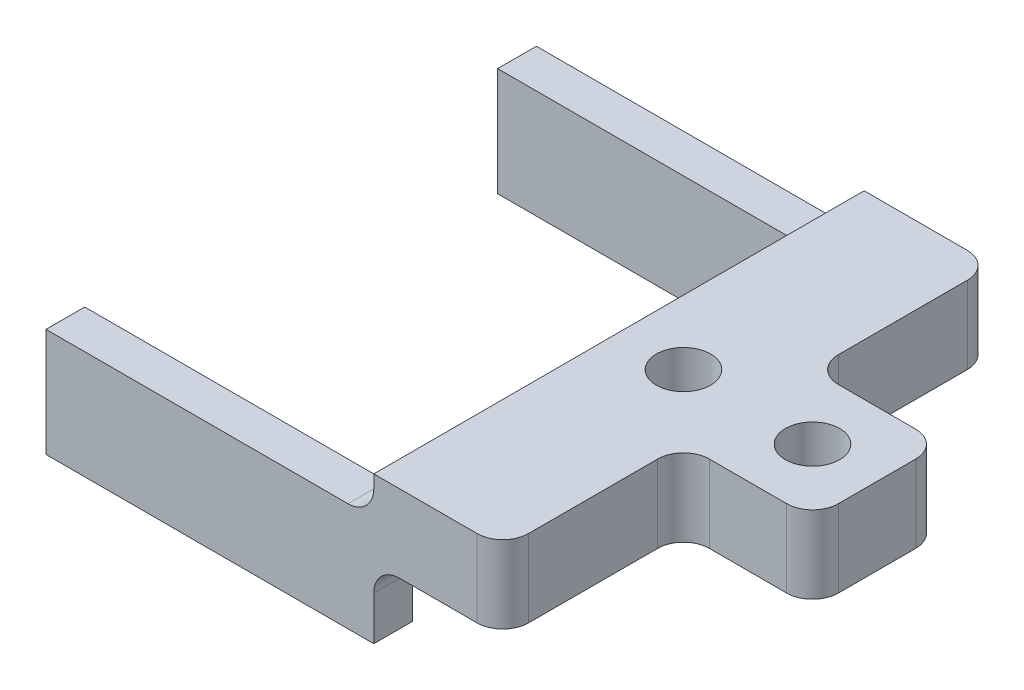
ISO-10303-21;
HEADER;
FILE_DESCRIPTION(('STEP AP214'),'2;1');
FILE_NAME('part.step','',(''),(''),'','','');
FILE_SCHEMA(('AUTOMOTIVE_DESIGN { 1 0 10303 214 1 1 1 1 }'));
ENDSEC;
DATA;
#1=APPLICATION_CONTEXT('core data for automotive mechanical design processes');
#2=APPLICATION_PROTOCOL_DEFINITION('international standard','automotive_design',2000,#1);
#3=PRODUCT_CONTEXT('',#1,'mechanical');
#4=PRODUCT('Part','Part','',(#3));
#5=PRODUCT_RELATED_PRODUCT_CATEGORY('part','',(#4));
#6=PRODUCT_DEFINITION_FORMATION('','',#4);
#7=PRODUCT_DEFINITION_CONTEXT('part definition',#1,'design');
#8=PRODUCT_DEFINITION('design','',#6,#7);
#9=PRODUCT_DEFINITION_SHAPE('','',#8);
#10=(LENGTH_UNIT() NAMED_UNIT(*) SI_UNIT(.MILLI.,.METRE.));
#11=(NAMED_UNIT(*) PLANE_ANGLE_UNIT() SI_UNIT($,.RADIAN.));
#12=(NAMED_UNIT(*) SI_UNIT($,.STERADIAN.) SOLID_ANGLE_UNIT());
#13=UNCERTAINTY_MEASURE_WITH_UNIT(LENGTH_MEASURE(1.E-05),#10,'distance_accuracy_value','');
#14=(GEOMETRIC_REPRESENTATION_CONTEXT(3) GLOBAL_UNCERTAINTY_ASSIGNED_CONTEXT((#13)) GLOBAL_UNIT_ASSIGNED_CONTEXT((#10,
#11,#12)) REPRESENTATION_CONTEXT('',''));
#15=CARTESIAN_POINT('',(0.,0.,0.));
#16=DIRECTION('',(0.,0.,1.));
#17=DIRECTION('',(1.,0.,0.));
#18=AXIS2_PLACEMENT_3D('',#15,#16,#17);
#19=CARTESIAN_POINT('',(-50.8216745568213,5.4,-79.6845406517609));
#20=DIRECTION('',(-1.,0.,0.));
#21=DIRECTION('',(0.,0.,1.));
#22=AXIS2_PLACEMENT_3D('',#19,#20,#21);
#23=PLANE('',#22);
#24=DIRECTION('',(0.,-1.,0.));
#25=VECTOR('',#24,1.);
#26=CARTESIAN_POINT('',(-50.8216745568213,8.4,-44.6845406517609));
#27=LINE('',#26,#25);
#28=CARTESIAN_POINT('',(-50.8216745568213,10.4,-44.6845406517609));
#29=VERTEX_POINT('',#28);
#30=CARTESIAN_POINT('',(-50.8216745568213,5.4,-44.6845406517609));
#31=VERTEX_POINT('',#30);
#32=EDGE_CURVE('E261',#29,#31,#27,.T.);
#33=ORIENTED_EDGE('',*,*,#32,.F.);
#34=DIRECTION('',(0.,0.,-1.));
#35=VECTOR('',#34,1.);
#36=CARTESIAN_POINT('',(-50.8216745568213,10.4,-41.6845406517609));
#37=LINE('',#36,#35);
#38=CARTESIAN_POINT('',(-50.8216745568213,10.4,-41.6845406517609));
#39=VERTEX_POINT('',#38);
#40=EDGE_CURVE('E463',#29,#39,#37,.F.);
#41=ORIENTED_EDGE('',*,*,#40,.T.);
#42=DIRECTION('',(0.,1.,0.));
#43=VECTOR('',#42,1.);
#44=CARTESIAN_POINT('',(-50.8216745568213,5.4,-41.6845406517609));
#45=LINE('',#44,#43);
#46=CARTESIAN_POINT('',(-50.8216745568213,11.4,-41.6845406517609));
#47=VERTEX_POINT('',#46);
#48=EDGE_CURVE('E323',#39,#47,#45,.T.);
#49=ORIENTED_EDGE('',*,*,#48,.T.);
#50=DIRECTION('',(0.,0.,1.));
#51=VECTOR('',#50,1.);
#52=CARTESIAN_POINT('',(-50.8216745568213,11.4,-79.6845406517609));
#53=LINE('',#52,#51);
#54=CARTESIAN_POINT('',(-50.8216745568213,11.4,-79.6845406517609));
#55=VERTEX_POINT('',#54);
#56=EDGE_CURVE('E253',#55,#47,#53,.T.);
#57=ORIENTED_EDGE('',*,*,#56,.F.);
#58=DIRECTION('',(0.,1.,0.));
#59=VECTOR('',#58,1.);
#60=CARTESIAN_POINT('',(-50.8216745568213,5.4,-79.6845406517609));
#61=LINE('',#60,#59);
#62=CARTESIAN_POINT('',(-50.8216745568213,10.4,-79.6845406517609));
#63=VERTEX_POINT('',#62);
#64=EDGE_CURVE('E324',#63,#55,#61,.T.);
#65=ORIENTED_EDGE('',*,*,#64,.F.);
#66=DIRECTION('',(0.,0.,-1.));
#67=VECTOR('',#66,1.);
#68=CARTESIAN_POINT('',(-50.8216745568213,10.4,-76.6845406517609));
#69=LINE('',#68,#67);
#70=CARTESIAN_POINT('',(-50.8216745568213,10.4,-76.6845406517609));
#71=VERTEX_POINT('',#70);
#72=EDGE_CURVE('E459',#63,#71,#69,.F.);
#73=ORIENTED_EDGE('',*,*,#72,.T.);
#74=DIRECTION('',(0.,-1.,0.));
#75=VECTOR('',#74,1.);
#76=CARTESIAN_POINT('',(-50.8216745568213,8.4,-76.6845406517609));
#77=LINE('',#76,#75);
#78=CARTESIAN_POINT('',(-50.8216745568213,5.4,-76.6845406517609));
#79=VERTEX_POINT('',#78);
#80=EDGE_CURVE('E362',#71,#79,#77,.T.);
#81=ORIENTED_EDGE('',*,*,#80,.T.);
#82=DIRECTION('',(0.,0.,1.));
#83=VECTOR('',#82,1.);
#84=CARTESIAN_POINT('',(-50.8216745568213,5.4,-79.6845406517609));
#85=LINE('',#84,#83);
#86=EDGE_CURVE('E292',#79,#31,#85,.T.);
#87=ORIENTED_EDGE('',*,*,#86,.T.);
#88=EDGE_LOOP('',(#33,#41,#49,#57,#65,#73,#81,#87));
#89=FACE_BOUND('',#88,.T.);
#90=ADVANCED_FACE('F39',(#89),#23,.T.);
#91=CARTESIAN_POINT('',(-76.2216745568213,8.4,-79.6845406517609));
#92=DIRECTION('',(1.,0.,0.));
#93=DIRECTION('',(0.,0.,-1.));
#94=AXIS2_PLACEMENT_3D('',#91,#92,#93);
#95=PLANE('',#94);
#96=DIRECTION('',(0.,0.,1.));
#97=VECTOR('',#96,1.);
#98=CARTESIAN_POINT('',(-76.2216745568213,0.,-79.6845406517609));
#99=LINE('',#98,#97);
#100=CARTESIAN_POINT('',(-76.2216745568213,0.,-79.6845406517609));
#101=VERTEX_POINT('',#100);
#102=CARTESIAN_POINT('',(-76.2216745568213,0.,-76.6845406517609));
#103=VERTEX_POINT('',#102);
#104=EDGE_CURVE('E327',#101,#103,#99,.T.);
#105=ORIENTED_EDGE('',*,*,#104,.T.);
#106=DIRECTION('',(0.,-1.,0.));
#107=VECTOR('',#106,1.);
#108=CARTESIAN_POINT('',(-76.2216745568213,8.4,-76.6845406517609));
#109=LINE('',#108,#107);
#110=CARTESIAN_POINT('',(-76.2216745568213,8.4,-76.6845406517609));
#111=VERTEX_POINT('',#110);
#112=EDGE_CURVE('E366',#111,#103,#109,.T.);
#113=ORIENTED_EDGE('',*,*,#112,.F.);
#114=DIRECTION('',(0.,0.,1.));
#115=VECTOR('',#114,1.);
#116=CARTESIAN_POINT('',(-76.2216745568213,8.4,-79.6845406517609));
#117=LINE('',#116,#115);
#118=CARTESIAN_POINT('',(-76.2216745568213,8.4,-79.6845406517609));
#119=VERTEX_POINT('',#118);
#120=EDGE_CURVE('E330',#119,#111,#117,.T.);
#121=ORIENTED_EDGE('',*,*,#120,.F.);
#122=DIRECTION('',(0.,-1.,0.));
#123=VECTOR('',#122,1.);
#124=CARTESIAN_POINT('',(-76.2216745568213,8.4,-79.6845406517609));
#125=LINE('',#124,#123);
#126=EDGE_CURVE('E341',#119,#101,#125,.T.);
#127=ORIENTED_EDGE('',*,*,#126,.T.);
#128=EDGE_LOOP('',(#105,#113,#121,#127));
#129=FACE_BOUND('',#128,.T.);
#130=ADVANCED_FACE('F520',(#129),#95,.F.);
#131=CARTESIAN_POINT('',(-76.2216745568213,8.4,-76.6845406517609));
#132=DIRECTION('',(0.,0.,-1.));
#133=DIRECTION('',(-1.,0.,0.));
#134=AXIS2_PLACEMENT_3D('',#131,#132,#133);
#135=PLANE('',#134);
#136=DIRECTION('',(1.,0.,0.));
#137=VECTOR('',#136,1.);
#138=CARTESIAN_POINT('',(-76.2216745568213,0.,-76.6845406517609));
#139=LINE('',#138,#137);
#140=CARTESIAN_POINT('',(-50.8216745568213,0.,-76.6845406517609));
#141=VERTEX_POINT('',#140);
#142=EDGE_CURVE('E345',#103,#141,#139,.T.);
#143=ORIENTED_EDGE('',*,*,#142,.T.);
#144=CARTESIAN_POINT('',(-50.8216745568213,3.4,-76.6845406517609));
#145=VERTEX_POINT('',#144);
#146=EDGE_CURVE('E361',#145,#141,#77,.T.);
#147=ORIENTED_EDGE('',*,*,#146,.F.);
#148=CARTESIAN_POINT('',(-48.8216745568213,3.4,-76.6845406517609));
#149=DIRECTION('',(0.,0.,-1.));
#150=DIRECTION('',(-1.,0.,0.));
#151=AXIS2_PLACEMENT_3D('',#148,#149,#150);
#152=CIRCLE('',#151,2.);
#153=CARTESIAN_POINT('',(-48.8216745568213,5.4,-76.6845406517609));
#154=VERTEX_POINT('',#153);
#155=EDGE_CURVE('E482',#145,#154,#152,.T.);
#156=ORIENTED_EDGE('',*,*,#155,.T.);
#157=DIRECTION('',(1.,0.,0.));
#158=VECTOR('',#157,1.);
#159=CARTESIAN_POINT('',(-76.2216745568213,5.4,-76.6845406517609));
#160=LINE('',#159,#158);
#161=EDGE_CURVE('E55',#79,#154,#160,.T.);
#162=ORIENTED_EDGE('',*,*,#161,.F.);
#163=ORIENTED_EDGE('',*,*,#80,.F.);
#164=CARTESIAN_POINT('',(-52.8216745568213,10.4,-76.6845406517609));
#165=DIRECTION('',(0.,0.,-1.));
#166=DIRECTION('',(-1.,0.,0.));
#167=AXIS2_PLACEMENT_3D('',#164,#165,#166);
#168=CIRCLE('',#167,2.);
#169=CARTESIAN_POINT('',(-52.8216745568213,8.4,-76.6845406517609));
#170=VERTEX_POINT('',#169);
#171=EDGE_CURVE('E11',#71,#170,#168,.T.);
#172=ORIENTED_EDGE('',*,*,#171,.T.);
#173=DIRECTION('',(1.,0.,0.));
#174=VECTOR('',#173,1.);
#175=CARTESIAN_POINT('',(-76.2216745568213,8.4,-76.6845406517609));
#176=LINE('',#175,#174);
#177=EDGE_CURVE('E334',#111,#170,#176,.T.);
#178=ORIENTED_EDGE('',*,*,#177,.F.);
#179=ORIENTED_EDGE('',*,*,#112,.T.);
#180=EDGE_LOOP('',(#143,#147,#156,#162,#163,#172,#178,#179));
#181=FACE_BOUND('',#180,.T.);
#182=ADVANCED_FACE('F515',(#181),#135,.F.);
#183=CARTESIAN_POINT('',(-50.8216745568213,8.4,-79.6845406517609));
#184=DIRECTION('',(-1.,0.,0.));
#185=DIRECTION('',(0.,0.,1.));
#186=AXIS2_PLACEMENT_3D('',#183,#184,#185);
#187=PLANE('',#186);
#188=DIRECTION('',(0.,-1.,0.));
#189=VECTOR('',#188,1.);
#190=CARTESIAN_POINT('',(-50.8216745568213,8.4,-79.6845406517609));
#191=LINE('',#190,#189);
#192=CARTESIAN_POINT('',(-50.8216745568213,3.4,-79.6845406517609));
#193=VERTEX_POINT('',#192);
#194=CARTESIAN_POINT('',(-50.8216745568213,0.,-79.6845406517609));
#195=VERTEX_POINT('',#194);
#196=EDGE_CURVE('E358',#193,#195,#191,.T.);
#197=ORIENTED_EDGE('',*,*,#196,.F.);
#198=DIRECTION('',(0.,0.,1.));
#199=VECTOR('',#198,1.);
#200=CARTESIAN_POINT('',(-50.8216745568213,3.4,-76.6845406517609));
#201=LINE('',#200,#199);
#202=EDGE_CURVE('E448',#193,#145,#201,.T.);
#203=ORIENTED_EDGE('',*,*,#202,.T.);
#204=ORIENTED_EDGE('',*,*,#146,.T.);
#205=DIRECTION('',(0.,0.,-1.));
#206=VECTOR('',#205,1.);
#207=CARTESIAN_POINT('',(-50.8216745568213,0.,-79.6845406517609));
#208=LINE('',#207,#206);
#209=EDGE_CURVE('E349',#141,#195,#208,.T.);
#210=ORIENTED_EDGE('',*,*,#209,.T.);
#211=EDGE_LOOP('',(#197,#203,#204,#210));
#212=FACE_BOUND('',#211,.T.);
#213=ADVANCED_FACE('F526',(#212),#187,.F.);
#214=CARTESIAN_POINT('',(-76.2216745568213,8.4,-79.6845406517609));
#215=DIRECTION('',(0.,0.,1.));
#216=DIRECTION('',(1.,0.,0.));
#217=AXIS2_PLACEMENT_3D('',#214,#215,#216);
#218=PLANE('',#217);
#219=DIRECTION('',(-1.,0.,0.));
#220=VECTOR('',#219,1.);
#221=CARTESIAN_POINT('',(-50.8216745568213,11.4,-79.6845406517609));
#222=LINE('',#221,#220);
#223=CARTESIAN_POINT('',(-42.8216745568213,11.4,-79.6845406517609));
#224=VERTEX_POINT('',#223);
#225=EDGE_CURVE('E288',#224,#55,#222,.T.);
#226=ORIENTED_EDGE('',*,*,#225,.F.);
#227=DIRECTION('',(0.,1.,0.));
#228=VECTOR('',#227,1.);
#229=CARTESIAN_POINT('',(-42.8216745568213,5.4,-79.6845406517609));
#230=LINE('',#229,#228);
#231=CARTESIAN_POINT('',(-42.8216745568213,5.4,-79.6845406517609));
#232=VERTEX_POINT('',#231);
#233=EDGE_CURVE('E445',#224,#232,#230,.F.);
#234=ORIENTED_EDGE('',*,*,#233,.T.);
#235=DIRECTION('',(-1.,0.,0.));
#236=VECTOR('',#235,1.);
#237=CARTESIAN_POINT('',(-50.8216745568213,5.4,-79.6845406517609));
#238=LINE('',#237,#236);
#239=CARTESIAN_POINT('',(-48.8216745568213,5.4,-79.6845406517609));
#240=VERTEX_POINT('',#239);
#241=EDGE_CURVE('E319',#232,#240,#238,.T.);
#242=ORIENTED_EDGE('',*,*,#241,.T.);
#243=CARTESIAN_POINT('',(-48.8216745568213,3.4,-79.6845406517609));
#244=DIRECTION('',(0.,0.,1.));
#245=DIRECTION('',(1.,0.,0.));
#246=AXIS2_PLACEMENT_3D('',#243,#244,#245);
#247=CIRCLE('',#246,2.);
#248=EDGE_CURVE('E485',#240,#193,#247,.T.);
#249=ORIENTED_EDGE('',*,*,#248,.T.);
#250=ORIENTED_EDGE('',*,*,#196,.T.);
#251=DIRECTION('',(-1.,0.,0.));
#252=VECTOR('',#251,1.);
#253=CARTESIAN_POINT('',(-76.2216745568213,0.,-79.6845406517609));
#254=LINE('',#253,#252);
#255=EDGE_CURVE('E335',#195,#101,#254,.T.);
#256=ORIENTED_EDGE('',*,*,#255,.T.);
#257=ORIENTED_EDGE('',*,*,#126,.F.);
#258=DIRECTION('',(-1.,0.,0.));
#259=VECTOR('',#258,1.);
#260=CARTESIAN_POINT('',(-76.2216745568213,8.4,-79.6845406517609));
#261=LINE('',#260,#259);
#262=CARTESIAN_POINT('',(-52.8216745568213,8.4,-79.6845406517609));
#263=VERTEX_POINT('',#262);
#264=EDGE_CURVE('E338',#263,#119,#261,.T.);
#265=ORIENTED_EDGE('',*,*,#264,.F.);
#266=CARTESIAN_POINT('',(-52.8216745568213,10.4,-79.6845406517609));
#267=DIRECTION('',(0.,0.,1.));
#268=DIRECTION('',(1.,0.,0.));
#269=AXIS2_PLACEMENT_3D('',#266,#267,#268);
#270=CIRCLE('',#269,2.);
#271=EDGE_CURVE('E48',#263,#63,#270,.T.);
#272=ORIENTED_EDGE('',*,*,#271,.T.);
#273=ORIENTED_EDGE('',*,*,#64,.T.);
#274=EDGE_LOOP('',(#226,#234,#242,#249,#250,#256,#257,#265,#272,#273));
#275=FACE_BOUND('',#274,.T.);
#276=ADVANCED_FACE('F504',(#275),#218,.F.);
#277=CARTESIAN_POINT('',(0.,8.4,0.));
#278=DIRECTION('',(0.,1.,0.));
#279=DIRECTION('',(0.,0.,1.));
#280=AXIS2_PLACEMENT_3D('',#277,#278,#279);
#281=PLANE('',#280);
#282=ORIENTED_EDGE('',*,*,#177,.T.);
#283=DIRECTION('',(0.,0.,-1.));
#284=VECTOR('',#283,1.);
#285=CARTESIAN_POINT('',(-52.8216745568213,8.4,-79.6845406517609));
#286=LINE('',#285,#284);
#287=EDGE_CURVE('E466',#170,#263,#286,.T.);
#288=ORIENTED_EDGE('',*,*,#287,.T.);
#289=ORIENTED_EDGE('',*,*,#264,.T.);
#290=ORIENTED_EDGE('',*,*,#120,.T.);
#291=EDGE_LOOP('',(#282,#288,#289,#290));
#292=FACE_BOUND('',#291,.T.);
#293=ADVANCED_FACE('F512',(#292),#281,.T.);
#294=CARTESIAN_POINT('',(0.,0.,0.));
#295=DIRECTION('',(0.,1.,0.));
#296=DIRECTION('',(0.,0.,1.));
#297=AXIS2_PLACEMENT_3D('',#294,#295,#296);
#298=PLANE('',#297);
#299=ORIENTED_EDGE('',*,*,#104,.F.);
#300=ORIENTED_EDGE('',*,*,#255,.F.);
#301=ORIENTED_EDGE('',*,*,#209,.F.);
#302=ORIENTED_EDGE('',*,*,#142,.F.);
#303=EDGE_LOOP('',(#299,#300,#301,#302));
#304=FACE_BOUND('',#303,.T.);
#305=ADVANCED_FACE('F523',(#304),#298,.F.);
#306=CARTESIAN_POINT('',(-40.8216745568213,5.4,-79.6845406517609));
#307=DIRECTION('',(1.,0.,0.));
#308=DIRECTION('',(0.,0.,-1.));
#309=AXIS2_PLACEMENT_3D('',#306,#307,#308);
#310=PLANE('',#309);
#311=DIRECTION('',(0.,0.,-1.));
#312=VECTOR('',#311,1.);
#313=CARTESIAN_POINT('',(-40.8216745568213,11.4,-79.6845406517609));
#314=LINE('',#313,#312);
#315=CARTESIAN_POINT('',(-40.8216745568213,11.4,-67.6845406517609));
#316=VERTEX_POINT('',#315);
#317=CARTESIAN_POINT('',(-40.8216745568213,11.4,-77.6845406517609));
#318=VERTEX_POINT('',#317);
#319=EDGE_CURVE('E284',#316,#318,#314,.T.);
#320=ORIENTED_EDGE('',*,*,#319,.F.);
#321=DIRECTION('',(0.,1.,0.));
#322=VECTOR('',#321,1.);
#323=CARTESIAN_POINT('',(-40.8216745568213,5.4,-67.6845406517609));
#324=LINE('',#323,#322);
#325=CARTESIAN_POINT('',(-40.8216745568213,5.4,-67.6845406517609));
#326=VERTEX_POINT('',#325);
#327=EDGE_CURVE('E442',#316,#326,#324,.F.);
#328=ORIENTED_EDGE('',*,*,#327,.T.);
#329=DIRECTION('',(0.,0.,-1.));
#330=VECTOR('',#329,1.);
#331=CARTESIAN_POINT('',(-40.8216745568213,5.4,-79.6845406517609));
#332=LINE('',#331,#330);
#333=CARTESIAN_POINT('',(-40.8216745568213,5.4,-77.6845406517609));
#334=VERTEX_POINT('',#333);
#335=EDGE_CURVE('E315',#326,#334,#332,.T.);
#336=ORIENTED_EDGE('',*,*,#335,.T.);
#337=DIRECTION('',(0.,1.,0.));
#338=VECTOR('',#337,1.);
#339=CARTESIAN_POINT('',(-40.8216745568213,11.4,-77.6845406517609));
#340=LINE('',#339,#338);
#341=EDGE_CURVE('E438',#334,#318,#340,.T.);
#342=ORIENTED_EDGE('',*,*,#341,.T.);
#343=EDGE_LOOP('',(#320,#328,#336,#342));
#344=FACE_BOUND('',#343,.T.);
#345=ADVANCED_FACE('F545',(#344),#310,.T.);
#346=CARTESIAN_POINT('',(-40.8216745568213,5.4,-65.6845406517609));
#347=DIRECTION('',(0.,0.,-1.));
#348=DIRECTION('',(-1.,0.,0.));
#349=AXIS2_PLACEMENT_3D('',#346,#347,#348);
#350=PLANE('',#349);
#351=DIRECTION('',(-1.,0.,0.));
#352=VECTOR('',#351,1.);
#353=CARTESIAN_POINT('',(-40.8216745568213,11.4,-65.6845406517609));
#354=LINE('',#353,#352);
#355=CARTESIAN_POINT('',(-32.8216745568213,11.4,-65.6845406517609));
#356=VERTEX_POINT('',#355);
#357=CARTESIAN_POINT('',(-38.8216745568213,11.4,-65.6845406517609));
#358=VERTEX_POINT('',#357);
#359=EDGE_CURVE('E280',#356,#358,#354,.T.);
#360=ORIENTED_EDGE('',*,*,#359,.F.);
#361=DIRECTION('',(0.,1.,0.));
#362=VECTOR('',#361,1.);
#363=CARTESIAN_POINT('',(-32.8216745568213,5.4,-65.6845406517609));
#364=LINE('',#363,#362);
#365=CARTESIAN_POINT('',(-32.8216745568213,5.4,-65.6845406517609));
#366=VERTEX_POINT('',#365);
#367=EDGE_CURVE('E393',#356,#366,#364,.F.);
#368=ORIENTED_EDGE('',*,*,#367,.T.);
#369=DIRECTION('',(-1.,0.,0.));
#370=VECTOR('',#369,1.);
#371=CARTESIAN_POINT('',(-40.8216745568213,5.4,-65.6845406517609));
#372=LINE('',#371,#370);
#373=CARTESIAN_POINT('',(-38.8216745568213,5.4,-65.6845406517609));
#374=VERTEX_POINT('',#373);
#375=EDGE_CURVE('E311',#366,#374,#372,.T.);
#376=ORIENTED_EDGE('',*,*,#375,.T.);
#377=DIRECTION('',(0.,1.,0.));
#378=VECTOR('',#377,1.);
#379=CARTESIAN_POINT('',(-38.8216745568213,11.4,-65.6845406517609));
#380=LINE('',#379,#378);
#381=EDGE_CURVE('E389',#374,#358,#380,.T.);
#382=ORIENTED_EDGE('',*,*,#381,.T.);
#383=EDGE_LOOP('',(#360,#368,#376,#382));
#384=FACE_BOUND('',#383,.T.);
#385=ADVANCED_FACE('F555',(#384),#350,.T.);
#386=CARTESIAN_POINT('',(-30.8216745568213,5.4,-65.6845406517609));
#387=DIRECTION('',(1.,0.,0.));
#388=DIRECTION('',(0.,0.,-1.));
#389=AXIS2_PLACEMENT_3D('',#386,#387,#388);
#390=PLANE('',#389);
#391=DIRECTION('',(0.,0.,-1.));
#392=VECTOR('',#391,1.);
#393=CARTESIAN_POINT('',(-30.8216745568213,5.4,-65.6845406517609));
#394=LINE('',#393,#392);
#395=CARTESIAN_POINT('',(-30.8216745568213,5.4,-57.6845406517609));
#396=VERTEX_POINT('',#395);
#397=CARTESIAN_POINT('',(-30.8216745568213,5.4,-63.6845406517609));
#398=VERTEX_POINT('',#397);
#399=EDGE_CURVE('E307',#396,#398,#394,.T.);
#400=ORIENTED_EDGE('',*,*,#399,.T.);
#401=DIRECTION('',(0.,1.,0.));
#402=VECTOR('',#401,1.);
#403=CARTESIAN_POINT('',(-30.8216745568213,5.4,-63.6845406517609));
#404=LINE('',#403,#402);
#405=CARTESIAN_POINT('',(-30.8216745568213,11.4,-63.6845406517609));
#406=VERTEX_POINT('',#405);
#407=EDGE_CURVE('E373',#398,#406,#404,.T.);
#408=ORIENTED_EDGE('',*,*,#407,.T.);
#409=DIRECTION('',(0.,0.,-1.));
#410=VECTOR('',#409,1.);
#411=CARTESIAN_POINT('',(-30.8216745568213,11.4,-65.6845406517609));
#412=LINE('',#411,#410);
#413=CARTESIAN_POINT('',(-30.8216745568213,11.4,-57.6845406517609));
#414=VERTEX_POINT('',#413);
#415=EDGE_CURVE('E276',#414,#406,#412,.T.);
#416=ORIENTED_EDGE('',*,*,#415,.F.);
#417=DIRECTION('',(0.,1.,0.));
#418=VECTOR('',#417,1.);
#419=CARTESIAN_POINT('',(-30.8216745568213,5.4,-57.6845406517609));
#420=LINE('',#419,#418);
#421=EDGE_CURVE('E370',#414,#396,#420,.F.);
#422=ORIENTED_EDGE('',*,*,#421,.T.);
#423=EDGE_LOOP('',(#400,#408,#416,#422));
#424=FACE_BOUND('',#423,.T.);
#425=ADVANCED_FACE('F564',(#424),#390,.T.);
#426=CARTESIAN_POINT('',(-40.8216745568213,5.4,-55.6845406517609));
#427=DIRECTION('',(0.,0.,1.));
#428=DIRECTION('',(1.,0.,0.));
#429=AXIS2_PLACEMENT_3D('',#426,#427,#428);
#430=PLANE('',#429);
#431=DIRECTION('',(1.,0.,0.));
#432=VECTOR('',#431,1.);
#433=CARTESIAN_POINT('',(-40.8216745568213,5.4,-55.6845406517609));
#434=LINE('',#433,#432);
#435=CARTESIAN_POINT('',(-38.8216745568213,5.4,-55.6845406517609));
#436=VERTEX_POINT('',#435);
#437=CARTESIAN_POINT('',(-32.8216745568213,5.4,-55.6845406517609));
#438=VERTEX_POINT('',#437);
#439=EDGE_CURVE('E303',#436,#438,#434,.T.);
#440=ORIENTED_EDGE('',*,*,#439,.T.);
#441=DIRECTION('',(0.,1.,0.));
#442=VECTOR('',#441,1.);
#443=CARTESIAN_POINT('',(-32.8216745568213,5.4,-55.6845406517609));
#444=LINE('',#443,#442);
#445=CARTESIAN_POINT('',(-32.8216745568213,11.4,-55.6845406517609));
#446=VERTEX_POINT('',#445);
#447=EDGE_CURVE('E423',#438,#446,#444,.T.);
#448=ORIENTED_EDGE('',*,*,#447,.T.);
#449=DIRECTION('',(1.,0.,0.));
#450=VECTOR('',#449,1.);
#451=CARTESIAN_POINT('',(-40.8216745568213,11.4,-55.6845406517609));
#452=LINE('',#451,#450);
#453=CARTESIAN_POINT('',(-38.8216745568213,11.4,-55.6845406517609));
#454=VERTEX_POINT('',#453);
#455=EDGE_CURVE('E272',#454,#446,#452,.T.);
#456=ORIENTED_EDGE('',*,*,#455,.F.);
#457=DIRECTION('',(0.,1.,0.));
#458=VECTOR('',#457,1.);
#459=CARTESIAN_POINT('',(-38.8216745568213,5.4,-55.6845406517609));
#460=LINE('',#459,#458);
#461=EDGE_CURVE('E420',#454,#436,#460,.F.);
#462=ORIENTED_EDGE('',*,*,#461,.T.);
#463=EDGE_LOOP('',(#440,#448,#456,#462));
#464=FACE_BOUND('',#463,.T.);
#465=ADVANCED_FACE('F572',(#464),#430,.T.);
#466=CARTESIAN_POINT('',(-40.8216745568213,5.4,-55.6845406517609));
#467=DIRECTION('',(1.,0.,0.));
#468=DIRECTION('',(0.,0.,-1.));
#469=AXIS2_PLACEMENT_3D('',#466,#467,#468);
#470=PLANE('',#469);
#471=DIRECTION('',(0.,0.,-1.));
#472=VECTOR('',#471,1.);
#473=CARTESIAN_POINT('',(-40.8216745568213,11.4,-55.6845406517609));
#474=LINE('',#473,#472);
#475=CARTESIAN_POINT('',(-40.8216745568213,11.4,-43.6845406517609));
#476=VERTEX_POINT('',#475);
#477=CARTESIAN_POINT('',(-40.8216745568213,11.4,-53.6845406517609));
#478=VERTEX_POINT('',#477);
#479=EDGE_CURVE('E268',#476,#478,#474,.T.);
#480=ORIENTED_EDGE('',*,*,#479,.F.);
#481=DIRECTION('',(0.,1.,0.));
#482=VECTOR('',#481,1.);
#483=CARTESIAN_POINT('',(-40.8216745568213,5.4,-43.6845406517609));
#484=LINE('',#483,#482);
#485=CARTESIAN_POINT('',(-40.8216745568213,5.4,-43.6845406517609));
#486=VERTEX_POINT('',#485);
#487=EDGE_CURVE('E435',#476,#486,#484,.F.);
#488=ORIENTED_EDGE('',*,*,#487,.T.);
#489=DIRECTION('',(0.,0.,-1.));
#490=VECTOR('',#489,1.);
#491=CARTESIAN_POINT('',(-40.8216745568213,5.4,-55.6845406517609));
#492=LINE('',#491,#490);
#493=CARTESIAN_POINT('',(-40.8216745568213,5.4,-53.6845406517609));
#494=VERTEX_POINT('',#493);
#495=EDGE_CURVE('E299',#486,#494,#492,.T.);
#496=ORIENTED_EDGE('',*,*,#495,.T.);
#497=DIRECTION('',(0.,1.,0.));
#498=VECTOR('',#497,1.);
#499=CARTESIAN_POINT('',(-40.8216745568213,11.4,-53.6845406517609));
#500=LINE('',#499,#498);
#501=EDGE_CURVE('E431',#494,#478,#500,.T.);
#502=ORIENTED_EDGE('',*,*,#501,.T.);
#503=EDGE_LOOP('',(#480,#488,#496,#502));
#504=FACE_BOUND('',#503,.T.);
#505=ADVANCED_FACE('F582',(#504),#470,.T.);
#506=CARTESIAN_POINT('',(-50.8216745568213,5.4,-41.6845406517609));
#507=DIRECTION('',(0.,0.,1.));
#508=DIRECTION('',(1.,0.,0.));
#509=AXIS2_PLACEMENT_3D('',#506,#507,#508);
#510=PLANE('',#509);
#511=DIRECTION('',(1.,0.,0.));
#512=VECTOR('',#511,1.);
#513=CARTESIAN_POINT('',(-50.8216745568213,5.4,-41.6845406517609));
#514=LINE('',#513,#512);
#515=CARTESIAN_POINT('',(-48.8216745568213,5.4,-41.6845406517609));
#516=VERTEX_POINT('',#515);
#517=CARTESIAN_POINT('',(-42.8216745568213,5.4,-41.6845406517609));
#518=VERTEX_POINT('',#517);
#519=EDGE_CURVE('E296',#516,#518,#514,.T.);
#520=ORIENTED_EDGE('',*,*,#519,.T.);
#521=DIRECTION('',(0.,1.,0.));
#522=VECTOR('',#521,1.);
#523=CARTESIAN_POINT('',(-42.8216745568213,5.4,-41.6845406517609));
#524=LINE('',#523,#522);
#525=CARTESIAN_POINT('',(-42.8216745568213,11.4,-41.6845406517609));
#526=VERTEX_POINT('',#525);
#527=EDGE_CURVE('E427',#518,#526,#524,.T.);
#528=ORIENTED_EDGE('',*,*,#527,.T.);
#529=DIRECTION('',(1.,0.,0.));
#530=VECTOR('',#529,1.);
#531=CARTESIAN_POINT('',(-50.8216745568213,11.4,-41.6845406517609));
#532=LINE('',#531,#530);
#533=EDGE_CURVE('E259',#47,#526,#532,.T.);
#534=ORIENTED_EDGE('',*,*,#533,.F.);
#535=ORIENTED_EDGE('',*,*,#48,.F.);
#536=CARTESIAN_POINT('',(-52.8216745568213,10.4,-41.6845406517609));
#537=DIRECTION('',(0.,0.,1.));
#538=DIRECTION('',(1.,0.,0.));
#539=AXIS2_PLACEMENT_3D('',#536,#537,#538);
#540=CIRCLE('',#539,2.);
#541=CARTESIAN_POINT('',(-52.8216745568213,8.4,-41.6845406517609));
#542=VERTEX_POINT('',#541);
#543=EDGE_CURVE('E232',#39,#542,#540,.F.);
#544=ORIENTED_EDGE('',*,*,#543,.T.);
#545=DIRECTION('',(1.,0.,0.));
#546=VECTOR('',#545,1.);
#547=CARTESIAN_POINT('',(-76.2216745568213,8.4,-41.6845406517609));
#548=LINE('',#547,#546);
#549=CARTESIAN_POINT('',(-76.2216745568213,8.4,-41.6845406517609));
#550=VERTEX_POINT('',#549);
#551=EDGE_CURVE('E222',#550,#542,#548,.T.);
#552=ORIENTED_EDGE('',*,*,#551,.F.);
#553=DIRECTION('',(0.,-1.,0.));
#554=VECTOR('',#553,1.);
#555=CARTESIAN_POINT('',(-76.2216745568213,8.4,-41.6845406517609));
#556=LINE('',#555,#554);
#557=CARTESIAN_POINT('',(-76.2216745568213,0.,-41.6845406517609));
#558=VERTEX_POINT('',#557);
#559=EDGE_CURVE('E228',#550,#558,#556,.T.);
#560=ORIENTED_EDGE('',*,*,#559,.T.);
#561=DIRECTION('',(1.,0.,0.));
#562=VECTOR('',#561,1.);
#563=CARTESIAN_POINT('',(-76.2216745568213,0.,-41.6845406517609));
#564=LINE('',#563,#562);
#565=CARTESIAN_POINT('',(-50.8216745568213,0.,-41.6845406517609));
#566=VERTEX_POINT('',#565);
#567=EDGE_CURVE('E617',#558,#566,#564,.T.);
#568=ORIENTED_EDGE('',*,*,#567,.T.);
#569=DIRECTION('',(0.,-1.,0.));
#570=VECTOR('',#569,1.);
#571=CARTESIAN_POINT('',(-50.8216745568213,8.4,-41.6845406517609));
#572=LINE('',#571,#570);
#573=CARTESIAN_POINT('',(-50.8216745568213,3.4,-41.6845406517609));
#574=VERTEX_POINT('',#573);
#575=EDGE_CURVE('E254',#574,#566,#572,.T.);
#576=ORIENTED_EDGE('',*,*,#575,.F.);
#577=CARTESIAN_POINT('',(-48.8216745568213,3.4,-41.6845406517609));
#578=DIRECTION('',(0.,0.,1.));
#579=DIRECTION('',(1.,0.,0.));
#580=AXIS2_PLACEMENT_3D('',#577,#578,#579);
#581=CIRCLE('',#580,2.);
#582=EDGE_CURVE('E488',#574,#516,#581,.F.);
#583=ORIENTED_EDGE('',*,*,#582,.T.);
#584=EDGE_LOOP('',(#520,#528,#534,#535,#544,#552,#560,#568,#576,#583));
#585=FACE_BOUND('',#584,.T.);
#586=ADVANCED_FACE('F225',(#585),#510,.T.);
#587=CARTESIAN_POINT('',(0.,5.4,0.));
#588=DIRECTION('',(0.,1.,0.));
#589=DIRECTION('',(0.,0.,1.));
#590=AXIS2_PLACEMENT_3D('',#587,#588,#589);
#591=PLANE('',#590);
#592=CARTESIAN_POINT('',(-45.8216745568213,5.4,-60.6845406517609));
#593=DIRECTION('',(0.,1.,0.));
#594=DIRECTION('',(0.,0.,1.));
#595=AXIS2_PLACEMENT_3D('',#592,#593,#594);
#596=CIRCLE('',#595,2.1);
#597=CARTESIAN_POINT('',(-45.8216745568213,5.4,-58.5845406517609));
#598=VERTEX_POINT('',#597);
#599=EDGE_CURVE('E622',#598,#598,#596,.F.);
#600=ORIENTED_EDGE('',*,*,#599,.F.);
#601=EDGE_LOOP('',(#600));
#602=FACE_BOUND('',#601,.T.);
#603=CARTESIAN_POINT('',(-35.8216745568213,5.4,-60.6845406517609));
#604=DIRECTION('',(0.,1.,0.));
#605=DIRECTION('',(0.,0.,1.));
#606=AXIS2_PLACEMENT_3D('',#603,#604,#605);
#607=CIRCLE('',#606,2.1);
#608=CARTESIAN_POINT('',(-35.8216745568213,5.4,-58.5845406517609));
#609=VERTEX_POINT('',#608);
#610=EDGE_CURVE('E625',#609,#609,#607,.F.);
#611=ORIENTED_EDGE('',*,*,#610,.F.);
#612=EDGE_LOOP('',(#611));
#613=FACE_BOUND('',#612,.T.);
#614=ORIENTED_EDGE('',*,*,#375,.F.);
#615=CARTESIAN_POINT('',(-32.8216745568213,5.4,-63.6845406517609));
#616=DIRECTION('',(0.,1.,0.));
#617=DIRECTION('',(0.,0.,1.));
#618=AXIS2_PLACEMENT_3D('',#615,#616,#617);
#619=CIRCLE('',#618,2.);
#620=EDGE_CURVE('E417',#366,#398,#619,.F.);
#621=ORIENTED_EDGE('',*,*,#620,.T.);
#622=ORIENTED_EDGE('',*,*,#399,.F.);
#623=CARTESIAN_POINT('',(-32.8216745568213,5.4,-57.6845406517609));
#624=DIRECTION('',(0.,1.,0.));
#625=DIRECTION('',(0.,0.,1.));
#626=AXIS2_PLACEMENT_3D('',#623,#624,#625);
#627=CIRCLE('',#626,2.);
#628=EDGE_CURVE('E414',#396,#438,#627,.F.);
#629=ORIENTED_EDGE('',*,*,#628,.T.);
#630=ORIENTED_EDGE('',*,*,#439,.F.);
#631=CARTESIAN_POINT('',(-38.8216745568213,5.4,-53.6845406517609));
#632=DIRECTION('',(0.,1.,0.));
#633=DIRECTION('',(0.,0.,1.));
#634=AXIS2_PLACEMENT_3D('',#631,#632,#633);
#635=CIRCLE('',#634,2.);
#636=EDGE_CURVE('E473',#436,#494,#635,.T.);
#637=ORIENTED_EDGE('',*,*,#636,.T.);
#638=ORIENTED_EDGE('',*,*,#495,.F.);
#639=CARTESIAN_POINT('',(-42.8216745568213,5.4,-43.6845406517609));
#640=DIRECTION('',(0.,1.,0.));
#641=DIRECTION('',(0.,0.,1.));
#642=AXIS2_PLACEMENT_3D('',#639,#640,#641);
#643=CIRCLE('',#642,2.);
#644=EDGE_CURVE('E411',#486,#518,#643,.F.);
#645=ORIENTED_EDGE('',*,*,#644,.T.);
#646=ORIENTED_EDGE('',*,*,#519,.F.);
#647=DIRECTION('',(0.,0.,1.));
#648=VECTOR('',#647,1.);
#649=CARTESIAN_POINT('',(-48.8216745568213,5.4,-44.6845406517609));
#650=LINE('',#649,#648);
#651=CARTESIAN_POINT('',(-48.8216745568213,5.4,-44.6845406517609));
#652=VERTEX_POINT('',#651);
#653=EDGE_CURVE('E399',#516,#652,#650,.F.);
#654=ORIENTED_EDGE('',*,*,#653,.T.);
#655=DIRECTION('',(-1.,0.,0.));
#656=VECTOR('',#655,1.);
#657=CARTESIAN_POINT('',(-76.2216745568213,5.4,-44.6845406517609));
#658=LINE('',#657,#656);
#659=EDGE_CURVE('E396',#652,#31,#658,.T.);
#660=ORIENTED_EDGE('',*,*,#659,.T.);
#661=ORIENTED_EDGE('',*,*,#86,.F.);
#662=ORIENTED_EDGE('',*,*,#161,.T.);
#663=DIRECTION('',(0.,0.,1.));
#664=VECTOR('',#663,1.);
#665=CARTESIAN_POINT('',(-48.8216745568213,5.4,-79.6845406517609));
#666=LINE('',#665,#664);
#667=EDGE_CURVE('E403',#154,#240,#666,.F.);
#668=ORIENTED_EDGE('',*,*,#667,.T.);
#669=ORIENTED_EDGE('',*,*,#241,.F.);
#670=CARTESIAN_POINT('',(-42.8216745568213,5.4,-77.6845406517609));
#671=DIRECTION('',(0.,1.,0.));
#672=DIRECTION('',(0.,0.,1.));
#673=AXIS2_PLACEMENT_3D('',#670,#671,#672);
#674=CIRCLE('',#673,2.);
#675=EDGE_CURVE('E408',#232,#334,#674,.F.);
#676=ORIENTED_EDGE('',*,*,#675,.T.);
#677=ORIENTED_EDGE('',*,*,#335,.F.);
#678=CARTESIAN_POINT('',(-38.8216745568213,5.4,-67.6845406517609));
#679=DIRECTION('',(0.,1.,0.));
#680=DIRECTION('',(0.,0.,1.));
#681=AXIS2_PLACEMENT_3D('',#678,#679,#680);
#682=CIRCLE('',#681,2.);
#683=EDGE_CURVE('E479',#326,#374,#682,.T.);
#684=ORIENTED_EDGE('',*,*,#683,.T.);
#685=EDGE_LOOP('',(#614,#621,#622,#629,#630,#637,#638,#645,#646,#654,#660,#661,#662,#668,#669,
#676,#677,#684));
#686=FACE_BOUND('',#685,.T.);
#687=ADVANCED_FACE('F533',(#602,#613,#686),#591,.F.);
#688=CARTESIAN_POINT('',(0.,11.4,0.));
#689=DIRECTION('',(0.,1.,0.));
#690=DIRECTION('',(0.,0.,1.));
#691=AXIS2_PLACEMENT_3D('',#688,#689,#690);
#692=PLANE('',#691);
#693=CARTESIAN_POINT('',(-45.8216745568213,11.4,-60.6845406517609));
#694=DIRECTION('',(0.,1.,0.));
#695=DIRECTION('',(0.,0.,1.));
#696=AXIS2_PLACEMENT_3D('',#693,#694,#695);
#697=CIRCLE('',#696,2.1);
#698=CARTESIAN_POINT('',(-45.8216745568213,11.4,-58.5845406517609));
#699=VERTEX_POINT('',#698);
#700=EDGE_CURVE('E629',#699,#699,#697,.T.);
#701=ORIENTED_EDGE('',*,*,#700,.F.);
#702=EDGE_LOOP('',(#701));
#703=FACE_BOUND('',#702,.T.);
#704=CARTESIAN_POINT('',(-35.8216745568213,11.4,-60.6845406517609));
#705=DIRECTION('',(0.,1.,0.));
#706=DIRECTION('',(0.,0.,1.));
#707=AXIS2_PLACEMENT_3D('',#704,#705,#706);
#708=CIRCLE('',#707,2.1);
#709=CARTESIAN_POINT('',(-35.8216745568213,11.4,-58.5845406517609));
#710=VERTEX_POINT('',#709);
#711=EDGE_CURVE('E630',#710,#710,#708,.T.);
#712=ORIENTED_EDGE('',*,*,#711,.F.);
#713=EDGE_LOOP('',(#712));
#714=FACE_BOUND('',#713,.T.);
#715=ORIENTED_EDGE('',*,*,#415,.T.);
#716=CARTESIAN_POINT('',(-32.8216745568213,11.4,-63.6845406517609));
#717=DIRECTION('',(0.,1.,0.));
#718=DIRECTION('',(0.,0.,1.));
#719=AXIS2_PLACEMENT_3D('',#716,#717,#718);
#720=CIRCLE('',#719,2.);
#721=EDGE_CURVE('E386',#406,#356,#720,.T.);
#722=ORIENTED_EDGE('',*,*,#721,.T.);
#723=ORIENTED_EDGE('',*,*,#359,.T.);
#724=CARTESIAN_POINT('',(-38.8216745568213,11.4,-67.6845406517609));
#725=DIRECTION('',(0.,1.,0.));
#726=DIRECTION('',(0.,0.,1.));
#727=AXIS2_PLACEMENT_3D('',#724,#725,#726);
#728=CIRCLE('',#727,2.);
#729=EDGE_CURVE('E476',#358,#316,#728,.F.);
#730=ORIENTED_EDGE('',*,*,#729,.T.);
#731=ORIENTED_EDGE('',*,*,#319,.T.);
#732=CARTESIAN_POINT('',(-42.8216745568213,11.4,-77.6845406517609));
#733=DIRECTION('',(0.,1.,0.));
#734=DIRECTION('',(0.,0.,1.));
#735=AXIS2_PLACEMENT_3D('',#732,#733,#734);
#736=CIRCLE('',#735,2.);
#737=EDGE_CURVE('E377',#318,#224,#736,.T.);
#738=ORIENTED_EDGE('',*,*,#737,.T.);
#739=ORIENTED_EDGE('',*,*,#225,.T.);
#740=ORIENTED_EDGE('',*,*,#56,.T.);
#741=ORIENTED_EDGE('',*,*,#533,.T.);
#742=CARTESIAN_POINT('',(-42.8216745568213,11.4,-43.6845406517609));
#743=DIRECTION('',(0.,1.,0.));
#744=DIRECTION('',(0.,0.,1.));
#745=AXIS2_PLACEMENT_3D('',#742,#743,#744);
#746=CIRCLE('',#745,2.);
#747=EDGE_CURVE('E380',#526,#476,#746,.T.);
#748=ORIENTED_EDGE('',*,*,#747,.T.);
#749=ORIENTED_EDGE('',*,*,#479,.T.);
#750=CARTESIAN_POINT('',(-38.8216745568213,11.4,-53.6845406517609));
#751=DIRECTION('',(0.,1.,0.));
#752=DIRECTION('',(0.,0.,1.));
#753=AXIS2_PLACEMENT_3D('',#750,#751,#752);
#754=CIRCLE('',#753,2.);
#755=EDGE_CURVE('E470',#478,#454,#754,.F.);
#756=ORIENTED_EDGE('',*,*,#755,.T.);
#757=ORIENTED_EDGE('',*,*,#455,.T.);
#758=CARTESIAN_POINT('',(-32.8216745568213,11.4,-57.6845406517609));
#759=DIRECTION('',(0.,1.,0.));
#760=DIRECTION('',(0.,0.,1.));
#761=AXIS2_PLACEMENT_3D('',#758,#759,#760);
#762=CIRCLE('',#761,2.);
#763=EDGE_CURVE('E383',#446,#414,#762,.T.);
#764=ORIENTED_EDGE('',*,*,#763,.T.);
#765=EDGE_LOOP('',(#715,#722,#723,#730,#731,#738,#739,#740,#741,#748,#749,#756,#757,#764));
#766=FACE_BOUND('',#765,.T.);
#767=ADVANCED_FACE('F548',(#703,#714,#766),#692,.T.);
#768=CARTESIAN_POINT('',(-50.8216745568213,8.4,-44.6845406517609));
#769=DIRECTION('',(-1.,0.,0.));
#770=DIRECTION('',(0.,0.,1.));
#771=AXIS2_PLACEMENT_3D('',#768,#769,#770);
#772=PLANE('',#771);
#773=CARTESIAN_POINT('',(-50.8216745568213,3.4,-44.6845406517609));
#774=VERTEX_POINT('',#773);
#775=CARTESIAN_POINT('',(-50.8216745568213,0.,-44.6845406517609));
#776=VERTEX_POINT('',#775);
#777=EDGE_CURVE('E599',#774,#776,#27,.T.);
#778=ORIENTED_EDGE('',*,*,#777,.F.);
#779=DIRECTION('',(0.,0.,1.));
#780=VECTOR('',#779,1.);
#781=CARTESIAN_POINT('',(-50.8216745568213,3.4,-41.6845406517609));
#782=LINE('',#781,#780);
#783=EDGE_CURVE('E452',#774,#574,#782,.T.);
#784=ORIENTED_EDGE('',*,*,#783,.T.);
#785=ORIENTED_EDGE('',*,*,#575,.T.);
#786=DIRECTION('',(0.,0.,-1.));
#787=VECTOR('',#786,1.);
#788=CARTESIAN_POINT('',(-50.8216745568213,0.,-44.6845406517609));
#789=LINE('',#788,#787);
#790=EDGE_CURVE('E605',#566,#776,#789,.T.);
#791=ORIENTED_EDGE('',*,*,#790,.T.);
#792=EDGE_LOOP('',(#778,#784,#785,#791));
#793=FACE_BOUND('',#792,.T.);
#794=ADVANCED_FACE('F603',(#793),#772,.F.);
#795=CARTESIAN_POINT('',(-76.2216745568213,8.4,-44.6845406517609));
#796=DIRECTION('',(1.,0.,0.));
#797=DIRECTION('',(0.,0.,-1.));
#798=AXIS2_PLACEMENT_3D('',#795,#796,#797);
#799=PLANE('',#798);
#800=DIRECTION('',(0.,0.,1.));
#801=VECTOR('',#800,1.);
#802=CARTESIAN_POINT('',(-76.2216745568213,0.,-44.6845406517609));
#803=LINE('',#802,#801);
#804=CARTESIAN_POINT('',(-76.2216745568213,0.,-44.6845406517609));
#805=VERTEX_POINT('',#804);
#806=EDGE_CURVE('E251',#805,#558,#803,.T.);
#807=ORIENTED_EDGE('',*,*,#806,.T.);
#808=ORIENTED_EDGE('',*,*,#559,.F.);
#809=DIRECTION('',(0.,0.,1.));
#810=VECTOR('',#809,1.);
#811=CARTESIAN_POINT('',(-76.2216745568213,8.4,-44.6845406517609));
#812=LINE('',#811,#810);
#813=CARTESIAN_POINT('',(-76.2216745568213,8.4,-44.6845406517609));
#814=VERTEX_POINT('',#813);
#815=EDGE_CURVE('E238',#814,#550,#812,.T.);
#816=ORIENTED_EDGE('',*,*,#815,.F.);
#817=DIRECTION('',(0.,-1.,0.));
#818=VECTOR('',#817,1.);
#819=CARTESIAN_POINT('',(-76.2216745568213,8.4,-44.6845406517609));
#820=LINE('',#819,#818);
#821=EDGE_CURVE('E608',#814,#805,#820,.T.);
#822=ORIENTED_EDGE('',*,*,#821,.T.);
#823=EDGE_LOOP('',(#807,#808,#816,#822));
#824=FACE_BOUND('',#823,.T.);
#825=ADVANCED_FACE('F249',(#824),#799,.F.);
#826=CARTESIAN_POINT('',(-76.2216745568213,8.4,-44.6845406517609));
#827=DIRECTION('',(0.,0.,1.));
#828=DIRECTION('',(1.,0.,0.));
#829=AXIS2_PLACEMENT_3D('',#826,#827,#828);
#830=PLANE('',#829);
#831=DIRECTION('',(-1.,0.,0.));
#832=VECTOR('',#831,1.);
#833=CARTESIAN_POINT('',(-76.2216745568213,0.,-44.6845406517609));
#834=LINE('',#833,#832);
#835=EDGE_CURVE('E247',#776,#805,#834,.T.);
#836=ORIENTED_EDGE('',*,*,#835,.T.);
#837=ORIENTED_EDGE('',*,*,#821,.F.);
#838=DIRECTION('',(-1.,0.,0.));
#839=VECTOR('',#838,1.);
#840=CARTESIAN_POINT('',(-76.2216745568213,8.4,-44.6845406517609));
#841=LINE('',#840,#839);
#842=CARTESIAN_POINT('',(-52.8216745568213,8.4,-44.6845406517609));
#843=VERTEX_POINT('',#842);
#844=EDGE_CURVE('E237',#843,#814,#841,.T.);
#845=ORIENTED_EDGE('',*,*,#844,.F.);
#846=CARTESIAN_POINT('',(-52.8216745568213,10.4,-44.6845406517609));
#847=DIRECTION('',(0.,0.,1.));
#848=DIRECTION('',(1.,0.,0.));
#849=AXIS2_PLACEMENT_3D('',#846,#847,#848);
#850=CIRCLE('',#849,2.);
#851=EDGE_CURVE('E494',#843,#29,#850,.T.);
#852=ORIENTED_EDGE('',*,*,#851,.T.);
#853=ORIENTED_EDGE('',*,*,#32,.T.);
#854=ORIENTED_EDGE('',*,*,#659,.F.);
#855=CARTESIAN_POINT('',(-48.8216745568213,3.4,-44.6845406517609));
#856=DIRECTION('',(0.,0.,1.));
#857=DIRECTION('',(1.,0.,0.));
#858=AXIS2_PLACEMENT_3D('',#855,#856,#857);
#859=CIRCLE('',#858,2.);
#860=EDGE_CURVE('E491',#652,#774,#859,.T.);
#861=ORIENTED_EDGE('',*,*,#860,.T.);
#862=ORIENTED_EDGE('',*,*,#777,.T.);
#863=EDGE_LOOP('',(#836,#837,#845,#852,#853,#854,#861,#862));
#864=FACE_BOUND('',#863,.T.);
#865=ADVANCED_FACE('F598',(#864),#830,.F.);
#866=CARTESIAN_POINT('',(0.,8.4,0.));
#867=DIRECTION('',(0.,1.,0.));
#868=DIRECTION('',(0.,0.,1.));
#869=AXIS2_PLACEMENT_3D('',#866,#867,#868);
#870=PLANE('',#869);
#871=ORIENTED_EDGE('',*,*,#551,.T.);
#872=DIRECTION('',(0.,0.,-1.));
#873=VECTOR('',#872,1.);
#874=CARTESIAN_POINT('',(-52.8216745568213,8.4,-44.6845406517609));
#875=LINE('',#874,#873);
#876=EDGE_CURVE('E456',#542,#843,#875,.T.);
#877=ORIENTED_EDGE('',*,*,#876,.T.);
#878=ORIENTED_EDGE('',*,*,#844,.T.);
#879=ORIENTED_EDGE('',*,*,#815,.T.);
#880=EDGE_LOOP('',(#871,#877,#878,#879));
#881=FACE_BOUND('',#880,.T.);
#882=ADVANCED_FACE('F241',(#881),#870,.T.);
#883=CARTESIAN_POINT('',(0.,0.,0.));
#884=DIRECTION('',(0.,1.,0.));
#885=DIRECTION('',(0.,0.,1.));
#886=AXIS2_PLACEMENT_3D('',#883,#884,#885);
#887=PLANE('',#886);
#888=ORIENTED_EDGE('',*,*,#806,.F.);
#889=ORIENTED_EDGE('',*,*,#835,.F.);
#890=ORIENTED_EDGE('',*,*,#790,.F.);
#891=ORIENTED_EDGE('',*,*,#567,.F.);
#892=EDGE_LOOP('',(#888,#889,#890,#891));
#893=FACE_BOUND('',#892,.T.);
#894=ADVANCED_FACE('F684',(#893),#887,.F.);
#895=CARTESIAN_POINT('',(-32.8216745568213,5.4,-63.6845406517609));
#896=DIRECTION('',(0.,1.,0.));
#897=DIRECTION('',(0.,0.,1.));
#898=AXIS2_PLACEMENT_3D('',#895,#896,#897);
#899=CYLINDRICAL_SURFACE('',#898,2.);
#900=ORIENTED_EDGE('',*,*,#620,.F.);
#901=ORIENTED_EDGE('',*,*,#367,.F.);
#902=ORIENTED_EDGE('',*,*,#721,.F.);
#903=ORIENTED_EDGE('',*,*,#407,.F.);
#904=EDGE_LOOP('',(#900,#901,#902,#903));
#905=FACE_BOUND('',#904,.T.);
#906=ADVANCED_FACE('F561',(#905),#899,.T.);
#907=CARTESIAN_POINT('',(-32.8216745568213,5.4,-57.6845406517609));
#908=DIRECTION('',(0.,1.,0.));
#909=DIRECTION('',(0.,0.,1.));
#910=AXIS2_PLACEMENT_3D('',#907,#908,#909);
#911=CYLINDRICAL_SURFACE('',#910,2.);
#912=ORIENTED_EDGE('',*,*,#628,.F.);
#913=ORIENTED_EDGE('',*,*,#421,.F.);
#914=ORIENTED_EDGE('',*,*,#763,.F.);
#915=ORIENTED_EDGE('',*,*,#447,.F.);
#916=EDGE_LOOP('',(#912,#913,#914,#915));
#917=FACE_BOUND('',#916,.T.);
#918=ADVANCED_FACE('F570',(#917),#911,.T.);
#919=CARTESIAN_POINT('',(-42.8216745568213,5.4,-43.6845406517609));
#920=DIRECTION('',(0.,1.,0.));
#921=DIRECTION('',(0.,0.,1.));
#922=AXIS2_PLACEMENT_3D('',#919,#920,#921);
#923=CYLINDRICAL_SURFACE('',#922,2.);
#924=ORIENTED_EDGE('',*,*,#644,.F.);
#925=ORIENTED_EDGE('',*,*,#487,.F.);
#926=ORIENTED_EDGE('',*,*,#747,.F.);
#927=ORIENTED_EDGE('',*,*,#527,.F.);
#928=EDGE_LOOP('',(#924,#925,#926,#927));
#929=FACE_BOUND('',#928,.T.);
#930=ADVANCED_FACE('F588',(#929),#923,.T.);
#931=CARTESIAN_POINT('',(-38.8216745568213,5.4,-53.6845406517609));
#932=DIRECTION('',(0.,-1.,0.));
#933=DIRECTION('',(0.,0.,-1.));
#934=AXIS2_PLACEMENT_3D('',#931,#932,#933);
#935=CYLINDRICAL_SURFACE('',#934,2.);
#936=ORIENTED_EDGE('',*,*,#636,.F.);
#937=ORIENTED_EDGE('',*,*,#461,.F.);
#938=ORIENTED_EDGE('',*,*,#755,.F.);
#939=ORIENTED_EDGE('',*,*,#501,.F.);
#940=EDGE_LOOP('',(#936,#937,#938,#939));
#941=FACE_BOUND('',#940,.T.);
#942=ADVANCED_FACE('F579',(#941),#935,.F.);
#943=CARTESIAN_POINT('',(-38.8216745568213,5.4,-67.6845406517609));
#944=DIRECTION('',(0.,-1.,0.));
#945=DIRECTION('',(0.,0.,-1.));
#946=AXIS2_PLACEMENT_3D('',#943,#944,#945);
#947=CYLINDRICAL_SURFACE('',#946,2.);
#948=ORIENTED_EDGE('',*,*,#683,.F.);
#949=ORIENTED_EDGE('',*,*,#327,.F.);
#950=ORIENTED_EDGE('',*,*,#729,.F.);
#951=ORIENTED_EDGE('',*,*,#381,.F.);
#952=EDGE_LOOP('',(#948,#949,#950,#951));
#953=FACE_BOUND('',#952,.T.);
#954=ADVANCED_FACE('F553',(#953),#947,.F.);
#955=CARTESIAN_POINT('',(-42.8216745568213,5.4,-77.6845406517609));
#956=DIRECTION('',(0.,-1.,0.));
#957=DIRECTION('',(0.,0.,-1.));
#958=AXIS2_PLACEMENT_3D('',#955,#956,#957);
#959=CYLINDRICAL_SURFACE('',#958,2.);
#960=ORIENTED_EDGE('',*,*,#675,.F.);
#961=ORIENTED_EDGE('',*,*,#233,.F.);
#962=ORIENTED_EDGE('',*,*,#737,.F.);
#963=ORIENTED_EDGE('',*,*,#341,.F.);
#964=EDGE_LOOP('',(#960,#961,#962,#963));
#965=FACE_BOUND('',#964,.T.);
#966=ADVANCED_FACE('F542',(#965),#959,.T.);
#967=CARTESIAN_POINT('',(-48.8216745568213,3.4,-79.6845406517609));
#968=DIRECTION('',(0.,0.,-1.));
#969=DIRECTION('',(-1.,0.,0.));
#970=AXIS2_PLACEMENT_3D('',#967,#968,#969);
#971=CYLINDRICAL_SURFACE('',#970,2.);
#972=ORIENTED_EDGE('',*,*,#248,.F.);
#973=ORIENTED_EDGE('',*,*,#667,.F.);
#974=ORIENTED_EDGE('',*,*,#155,.F.);
#975=ORIENTED_EDGE('',*,*,#202,.F.);
#976=EDGE_LOOP('',(#972,#973,#974,#975));
#977=FACE_BOUND('',#976,.T.);
#978=ADVANCED_FACE('F536',(#977),#971,.F.);
#979=CARTESIAN_POINT('',(-48.8216745568213,3.4,-44.6845406517609));
#980=DIRECTION('',(0.,0.,-1.));
#981=DIRECTION('',(-1.,0.,0.));
#982=AXIS2_PLACEMENT_3D('',#979,#980,#981);
#983=CYLINDRICAL_SURFACE('',#982,2.);
#984=ORIENTED_EDGE('',*,*,#860,.F.);
#985=ORIENTED_EDGE('',*,*,#653,.F.);
#986=ORIENTED_EDGE('',*,*,#582,.F.);
#987=ORIENTED_EDGE('',*,*,#783,.F.);
#988=EDGE_LOOP('',(#984,#985,#986,#987));
#989=FACE_BOUND('',#988,.T.);
#990=ADVANCED_FACE('F594',(#989),#983,.F.);
#991=CARTESIAN_POINT('',(-52.8216745568213,10.4,0.));
#992=DIRECTION('',(0.,0.,1.));
#993=DIRECTION('',(1.,0.,0.));
#994=AXIS2_PLACEMENT_3D('',#991,#992,#993);
#995=CYLINDRICAL_SURFACE('',#994,2.);
#996=ORIENTED_EDGE('',*,*,#543,.F.);
#997=ORIENTED_EDGE('',*,*,#40,.F.);
#998=ORIENTED_EDGE('',*,*,#851,.F.);
#999=ORIENTED_EDGE('',*,*,#876,.F.);
#1000=EDGE_LOOP('',(#996,#997,#998,#999));
#1001=FACE_BOUND('',#1000,.T.);
#1002=ADVANCED_FACE('F698',(#1001),#995,.F.);
#1003=CARTESIAN_POINT('',(-52.8216745568213,10.4,0.));
#1004=DIRECTION('',(0.,0.,1.));
#1005=DIRECTION('',(1.,0.,0.));
#1006=AXIS2_PLACEMENT_3D('',#1003,#1004,#1005);
#1007=CYLINDRICAL_SURFACE('',#1006,2.);
#1008=ORIENTED_EDGE('',*,*,#171,.F.);
#1009=ORIENTED_EDGE('',*,*,#72,.F.);
#1010=ORIENTED_EDGE('',*,*,#271,.F.);
#1011=ORIENTED_EDGE('',*,*,#287,.F.);
#1012=EDGE_LOOP('',(#1008,#1009,#1010,#1011));
#1013=FACE_BOUND('',#1012,.T.);
#1014=ADVANCED_FACE('F41',(#1013),#1007,.F.);
#1015=CARTESIAN_POINT('',(-35.8216745568213,-0.000999999999999265,-60.6845406517609));
#1016=DIRECTION('',(0.,1.,0.));
#1017=DIRECTION('',(0.,0.,1.));
#1018=AXIS2_PLACEMENT_3D('',#1015,#1016,#1017);
#1019=CYLINDRICAL_SURFACE('',#1018,2.1);
#1020=ORIENTED_EDGE('',*,*,#711,.T.);
#1021=EDGE_LOOP('',(#1020));
#1022=FACE_BOUND('',#1021,.T.);
#1023=ORIENTED_EDGE('',*,*,#610,.T.);
#1024=EDGE_LOOP('',(#1023));
#1025=FACE_BOUND('',#1024,.T.);
#1026=ADVANCED_FACE('F649',(#1022,#1025),#1019,.F.);
#1027=CARTESIAN_POINT('',(-45.8216745568213,-0.000999999999999265,-60.6845406517609));
#1028=DIRECTION('',(0.,1.,0.));
#1029=DIRECTION('',(0.,0.,1.));
#1030=AXIS2_PLACEMENT_3D('',#1027,#1028,#1029);
#1031=CYLINDRICAL_SURFACE('',#1030,2.1);
#1032=ORIENTED_EDGE('',*,*,#700,.T.);
#1033=EDGE_LOOP('',(#1032));
#1034=FACE_BOUND('',#1033,.T.);
#1035=ORIENTED_EDGE('',*,*,#599,.T.);
#1036=EDGE_LOOP('',(#1035));
#1037=FACE_BOUND('',#1036,.T.);
#1038=ADVANCED_FACE('F641',(#1034,#1037),#1031,.F.);
#1039=CLOSED_SHELL('',(#90,#130,#182,#213,#276,#293,#305,#345,#385,#425,#465,#505,#586,#687,
#767,#794,#825,#865,#882,#894,#906,#918,#930,#942,#954,#966,#978,#990,#1002,#1014,#1026,#1038));
#1040=MANIFOLD_SOLID_BREP('B2',#1039);
#1041=ADVANCED_BREP_SHAPE_REPRESENTATION('',(#18,#1040),#14);
#1042=SHAPE_DEFINITION_REPRESENTATION(#9,#1041);
ENDSEC;
END-ISO-10303-21;
